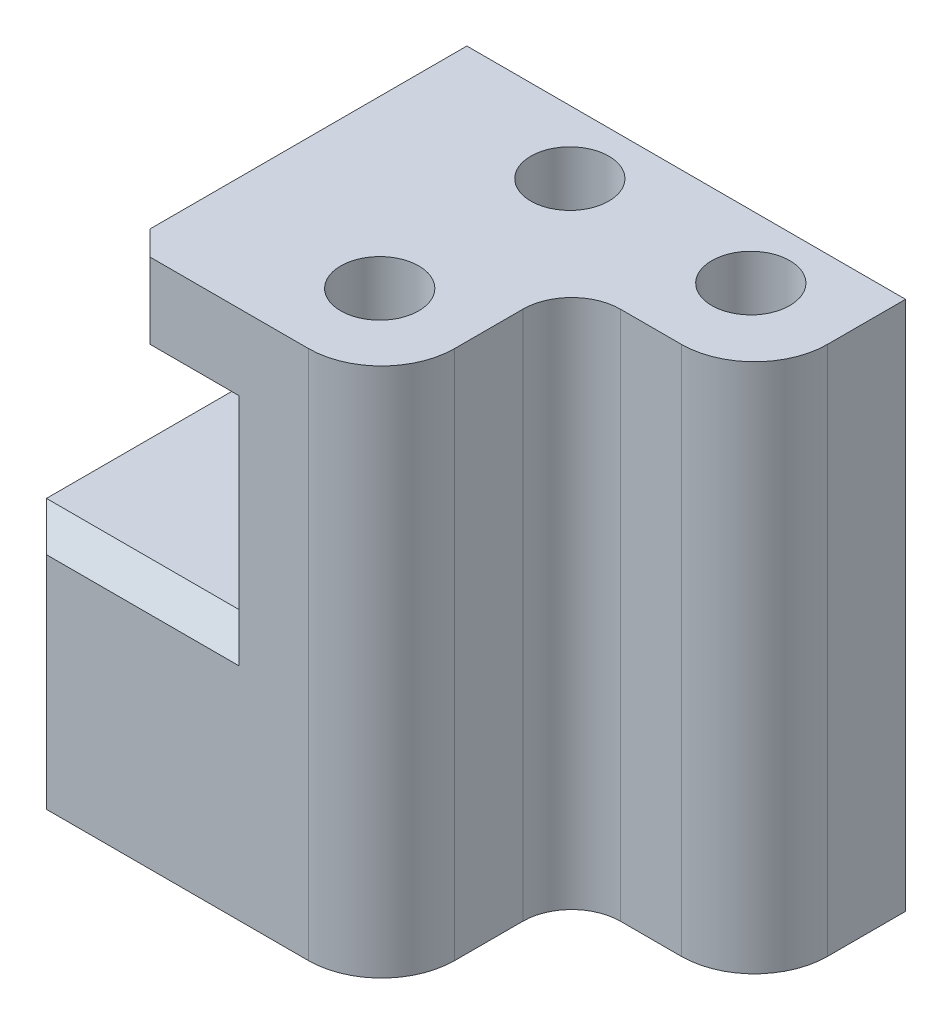
ISO-10303-21;
HEADER;
FILE_DESCRIPTION(('STEP AP214'),'2;1');
FILE_NAME('part.step','',(''),(''),'','','');
FILE_SCHEMA(('AUTOMOTIVE_DESIGN { 1 0 10303 214 1 1 1 1 }'));
ENDSEC;
DATA;
#1=APPLICATION_CONTEXT('core data for automotive mechanical design processes');
#2=APPLICATION_PROTOCOL_DEFINITION('international standard','automotive_design',2000,#1);
#3=PRODUCT_CONTEXT('',#1,'mechanical');
#4=PRODUCT('Part','Part','',(#3));
#5=PRODUCT_RELATED_PRODUCT_CATEGORY('part','',(#4));
#6=PRODUCT_DEFINITION_FORMATION('','',#4);
#7=PRODUCT_DEFINITION_CONTEXT('part definition',#1,'design');
#8=PRODUCT_DEFINITION('design','',#6,#7);
#9=PRODUCT_DEFINITION_SHAPE('','',#8);
#10=(LENGTH_UNIT() NAMED_UNIT(*) SI_UNIT(.MILLI.,.METRE.));
#11=(NAMED_UNIT(*) PLANE_ANGLE_UNIT() SI_UNIT($,.RADIAN.));
#12=(NAMED_UNIT(*) SI_UNIT($,.STERADIAN.) SOLID_ANGLE_UNIT());
#13=UNCERTAINTY_MEASURE_WITH_UNIT(LENGTH_MEASURE(1.E-05),#10,'distance_accuracy_value','');
#14=(GEOMETRIC_REPRESENTATION_CONTEXT(3) GLOBAL_UNCERTAINTY_ASSIGNED_CONTEXT((#13)) GLOBAL_UNIT_ASSIGNED_CONTEXT((#10,
#11,#12)) REPRESENTATION_CONTEXT('',''));
#15=CARTESIAN_POINT('',(0.,0.,0.));
#16=DIRECTION('',(0.,0.,1.));
#17=DIRECTION('',(1.,0.,0.));
#18=AXIS2_PLACEMENT_3D('',#15,#16,#17);
#19=CARTESIAN_POINT('',(-14.75,0.,15.));
#20=DIRECTION('',(0.,1.,0.));
#21=DIRECTION('',(0.,0.,1.));
#22=AXIS2_PLACEMENT_3D('',#19,#20,#21);
#23=PLANE('',#22);
#24=CARTESIAN_POINT('',(-3.67499999999998,0.,3.6));
#25=DIRECTION('',(0.,1.,0.));
#26=DIRECTION('',(0.,0.,1.));
#27=AXIS2_PLACEMENT_3D('',#24,#25,#26);
#28=CIRCLE('',#27,1.6);
#29=CARTESIAN_POINT('',(-3.67499999999998,0.,5.2));
#30=VERTEX_POINT('',#29);
#31=EDGE_CURVE('E356',#30,#30,#28,.F.);
#32=ORIENTED_EDGE('',*,*,#31,.F.);
#33=EDGE_LOOP('',(#32));
#34=FACE_BOUND('',#33,.T.);
#35=CARTESIAN_POINT('',(-3.67499999999998,0.,11.4));
#36=DIRECTION('',(0.,1.,0.));
#37=DIRECTION('',(0.,0.,1.));
#38=AXIS2_PLACEMENT_3D('',#35,#36,#37);
#39=CIRCLE('',#38,1.6);
#40=CARTESIAN_POINT('',(-3.67499999999998,0.,13.));
#41=VERTEX_POINT('',#40);
#42=EDGE_CURVE('E357',#41,#41,#39,.F.);
#43=ORIENTED_EDGE('',*,*,#42,.F.);
#44=EDGE_LOOP('',(#43));
#45=FACE_BOUND('',#44,.T.);
#46=DIRECTION('',(1.,0.,0.));
#47=VECTOR('',#46,1.);
#48=CARTESIAN_POINT('',(-14.75,0.,15.));
#49=LINE('',#48,#47);
#50=CARTESIAN_POINT('',(-13.75,0.,15.));
#51=VERTEX_POINT('',#50);
#52=CARTESIAN_POINT('',(-3.,0.,15.));
#53=VERTEX_POINT('',#52);
#54=EDGE_CURVE('E354',#51,#53,#49,.T.);
#55=ORIENTED_EDGE('',*,*,#54,.F.);
#56=DIRECTION('',(-0.707106781186546,0.,-0.707106781186549));
#57=VECTOR('',#56,1.);
#58=CARTESIAN_POINT('',(-13.75,0.,15.));
#59=LINE('',#58,#57);
#60=CARTESIAN_POINT('',(-14.75,0.,14.));
#61=VERTEX_POINT('',#60);
#62=EDGE_CURVE('E297',#51,#61,#59,.T.);
#63=ORIENTED_EDGE('',*,*,#62,.T.);
#64=DIRECTION('',(0.,0.,-1.));
#65=VECTOR('',#64,1.);
#66=CARTESIAN_POINT('',(-14.75,0.,15.));
#67=LINE('',#66,#65);
#68=CARTESIAN_POINT('',(-14.75,0.,0.999999999999997));
#69=VERTEX_POINT('',#68);
#70=EDGE_CURVE('E350',#61,#69,#67,.T.);
#71=ORIENTED_EDGE('',*,*,#70,.T.);
#72=DIRECTION('',(1.,0.,0.));
#73=VECTOR('',#72,1.);
#74=CARTESIAN_POINT('',(-14.75,0.,0.999999999999997));
#75=LINE('',#74,#73);
#76=CARTESIAN_POINT('',(7.50000000000001,0.,0.999999999999997));
#77=VERTEX_POINT('',#76);
#78=EDGE_CURVE('E261',#69,#77,#75,.T.);
#79=ORIENTED_EDGE('',*,*,#78,.T.);
#80=DIRECTION('',(0.,0.,1.));
#81=VECTOR('',#80,1.);
#82=CARTESIAN_POINT('',(7.50000000000001,0.,7.2));
#83=LINE('',#82,#81);
#84=CARTESIAN_POINT('',(7.50000000000001,0.,4.2));
#85=VERTEX_POINT('',#84);
#86=EDGE_CURVE('E373',#77,#85,#83,.T.);
#87=ORIENTED_EDGE('',*,*,#86,.T.);
#88=CARTESIAN_POINT('',(4.50000000000001,0.,4.2));
#89=DIRECTION('',(0.,1.,0.));
#90=DIRECTION('',(0.,0.,1.));
#91=AXIS2_PLACEMENT_3D('',#88,#89,#90);
#92=CIRCLE('',#91,3.);
#93=CARTESIAN_POINT('',(4.50000000000002,0.,7.2));
#94=VERTEX_POINT('',#93);
#95=EDGE_CURVE('E213',#85,#94,#92,.F.);
#96=ORIENTED_EDGE('',*,*,#95,.T.);
#97=DIRECTION('',(-1.,0.,0.));
#98=VECTOR('',#97,1.);
#99=CARTESIAN_POINT('',(7.50000000000002,0.,7.2));
#100=LINE('',#99,#98);
#101=CARTESIAN_POINT('',(2.,0.,7.2));
#102=VERTEX_POINT('',#101);
#103=EDGE_CURVE('E191',#94,#102,#100,.T.);
#104=ORIENTED_EDGE('',*,*,#103,.T.);
#105=CARTESIAN_POINT('',(2.,0.,9.2));
#106=DIRECTION('',(0.,1.,0.));
#107=DIRECTION('',(0.,0.,1.));
#108=AXIS2_PLACEMENT_3D('',#105,#106,#107);
#109=CIRCLE('',#108,2.);
#110=CARTESIAN_POINT('',(0.,0.,9.2));
#111=VERTEX_POINT('',#110);
#112=EDGE_CURVE('E187',#102,#111,#109,.T.);
#113=ORIENTED_EDGE('',*,*,#112,.T.);
#114=DIRECTION('',(0.,0.,-1.));
#115=VECTOR('',#114,1.);
#116=CARTESIAN_POINT('',(0.,0.,15.));
#117=LINE('',#116,#115);
#118=CARTESIAN_POINT('',(0.,0.,12.));
#119=VERTEX_POINT('',#118);
#120=EDGE_CURVE('E173',#119,#111,#117,.T.);
#121=ORIENTED_EDGE('',*,*,#120,.F.);
#122=CARTESIAN_POINT('',(-3.,0.,12.));
#123=DIRECTION('',(0.,1.,0.));
#124=DIRECTION('',(0.,0.,1.));
#125=AXIS2_PLACEMENT_3D('',#122,#123,#124);
#126=CIRCLE('',#125,3.);
#127=EDGE_CURVE('E215',#119,#53,#126,.F.);
#128=ORIENTED_EDGE('',*,*,#127,.T.);
#129=EDGE_LOOP('',(#55,#63,#71,#79,#87,#96,#104,#113,#121,#128));
#130=FACE_BOUND('',#129,.T.);
#131=CARTESIAN_POINT('',(3.75000000000001,0.,3.6));
#132=DIRECTION('',(0.,1.,0.));
#133=DIRECTION('',(0.,0.,1.));
#134=AXIS2_PLACEMENT_3D('',#131,#132,#133);
#135=CIRCLE('',#134,1.6);
#136=CARTESIAN_POINT('',(3.75000000000001,0.,5.2));
#137=VERTEX_POINT('',#136);
#138=EDGE_CURVE('E364',#137,#137,#135,.F.);
#139=ORIENTED_EDGE('',*,*,#138,.F.);
#140=EDGE_LOOP('',(#139));
#141=FACE_BOUND('',#140,.T.);
#142=ADVANCED_FACE('F35',(#34,#45,#130,#141),#23,.F.);
#143=CARTESIAN_POINT('',(0.,0.,15.));
#144=DIRECTION('',(-1.,0.,0.));
#145=DIRECTION('',(0.,0.,1.));
#146=AXIS2_PLACEMENT_3D('',#143,#144,#145);
#147=PLANE('',#146);
#148=DIRECTION('',(0.,0.,-1.));
#149=VECTOR('',#148,1.);
#150=CARTESIAN_POINT('',(0.,21.75,15.));
#151=LINE('',#150,#149);
#152=CARTESIAN_POINT('',(0.,21.75,12.));
#153=VERTEX_POINT('',#152);
#154=CARTESIAN_POINT('',(0.,21.75,9.2));
#155=VERTEX_POINT('',#154);
#156=EDGE_CURVE('E184',#153,#155,#151,.T.);
#157=ORIENTED_EDGE('',*,*,#156,.F.);
#158=DIRECTION('',(0.,1.,0.));
#159=VECTOR('',#158,1.);
#160=CARTESIAN_POINT('',(0.,0.,12.));
#161=LINE('',#160,#159);
#162=EDGE_CURVE('E180',#153,#119,#161,.F.);
#163=ORIENTED_EDGE('',*,*,#162,.T.);
#164=ORIENTED_EDGE('',*,*,#120,.T.);
#165=DIRECTION('',(0.,1.,0.));
#166=VECTOR('',#165,1.);
#167=CARTESIAN_POINT('',(0.,0.,9.2));
#168=LINE('',#167,#166);
#169=EDGE_CURVE('E178',#111,#155,#168,.T.);
#170=ORIENTED_EDGE('',*,*,#169,.T.);
#171=EDGE_LOOP('',(#157,#163,#164,#170));
#172=FACE_BOUND('',#171,.T.);
#173=ADVANCED_FACE('F176',(#172),#147,.F.);
#174=CARTESIAN_POINT('',(0.,21.75,15.));
#175=DIRECTION('',(0.,-1.,0.));
#176=DIRECTION('',(1.,0.,0.));
#177=AXIS2_PLACEMENT_3D('',#174,#175,#176);
#178=PLANE('',#177);
#179=CARTESIAN_POINT('',(-3.67499999999999,21.75,3.6));
#180=DIRECTION('',(0.,1.,0.));
#181=DIRECTION('',(-1.,0.,0.));
#182=AXIS2_PLACEMENT_3D('',#179,#180,#181);
#183=CIRCLE('',#182,1.6);
#184=CARTESIAN_POINT('',(-5.27499999999999,21.75,3.6));
#185=VERTEX_POINT('',#184);
#186=EDGE_CURVE('E360',#185,#185,#183,.T.);
#187=ORIENTED_EDGE('',*,*,#186,.F.);
#188=EDGE_LOOP('',(#187));
#189=FACE_BOUND('',#188,.T.);
#190=CARTESIAN_POINT('',(-3.67499999999999,21.75,11.4));
#191=DIRECTION('',(0.,1.,0.));
#192=DIRECTION('',(-1.,0.,0.));
#193=AXIS2_PLACEMENT_3D('',#190,#191,#192);
#194=CIRCLE('',#193,1.6);
#195=CARTESIAN_POINT('',(-5.27499999999999,21.75,11.4));
#196=VERTEX_POINT('',#195);
#197=EDGE_CURVE('E361',#196,#196,#194,.T.);
#198=ORIENTED_EDGE('',*,*,#197,.F.);
#199=EDGE_LOOP('',(#198));
#200=FACE_BOUND('',#199,.T.);
#201=DIRECTION('',(0.,0.,-1.));
#202=VECTOR('',#201,1.);
#203=CARTESIAN_POINT('',(-10.5,21.75,15.));
#204=LINE('',#203,#202);
#205=CARTESIAN_POINT('',(-10.5,21.75,14.));
#206=VERTEX_POINT('',#205);
#207=CARTESIAN_POINT('',(-10.5,21.75,0.999999999999997));
#208=VERTEX_POINT('',#207);
#209=EDGE_CURVE('E331',#206,#208,#204,.T.);
#210=ORIENTED_EDGE('',*,*,#209,.F.);
#211=DIRECTION('',(0.707106781186545,0.,0.707106781186549));
#212=VECTOR('',#211,1.);
#213=CARTESIAN_POINT('',(-9.49999999999999,21.75,15.));
#214=LINE('',#213,#212);
#215=CARTESIAN_POINT('',(-9.5,21.75,15.));
#216=VERTEX_POINT('',#215);
#217=EDGE_CURVE('E303',#206,#216,#214,.T.);
#218=ORIENTED_EDGE('',*,*,#217,.T.);
#219=DIRECTION('',(-1.,0.,0.));
#220=VECTOR('',#219,1.);
#221=CARTESIAN_POINT('',(0.,21.75,15.));
#222=LINE('',#221,#220);
#223=CARTESIAN_POINT('',(-3.,21.75,15.));
#224=VERTEX_POINT('',#223);
#225=EDGE_CURVE('E352',#224,#216,#222,.T.);
#226=ORIENTED_EDGE('',*,*,#225,.F.);
#227=CARTESIAN_POINT('',(-3.,21.75,12.));
#228=DIRECTION('',(0.,-1.,0.));
#229=DIRECTION('',(1.,0.,0.));
#230=AXIS2_PLACEMENT_3D('',#227,#228,#229);
#231=CIRCLE('',#230,3.);
#232=EDGE_CURVE('E210',#224,#153,#231,.F.);
#233=ORIENTED_EDGE('',*,*,#232,.T.);
#234=ORIENTED_EDGE('',*,*,#156,.T.);
#235=CARTESIAN_POINT('',(2.,21.75,9.2));
#236=DIRECTION('',(0.,-1.,0.));
#237=DIRECTION('',(1.,0.,0.));
#238=AXIS2_PLACEMENT_3D('',#235,#236,#237);
#239=CIRCLE('',#238,2.);
#240=CARTESIAN_POINT('',(2.,21.75,7.2));
#241=VERTEX_POINT('',#240);
#242=EDGE_CURVE('E196',#155,#241,#239,.T.);
#243=ORIENTED_EDGE('',*,*,#242,.T.);
#244=DIRECTION('',(1.,0.,0.));
#245=VECTOR('',#244,1.);
#246=CARTESIAN_POINT('',(7.50000000000001,21.75,7.2));
#247=LINE('',#246,#245);
#248=CARTESIAN_POINT('',(4.50000000000001,21.75,7.2));
#249=VERTEX_POINT('',#248);
#250=EDGE_CURVE('E374',#241,#249,#247,.T.);
#251=ORIENTED_EDGE('',*,*,#250,.T.);
#252=CARTESIAN_POINT('',(4.50000000000001,21.75,4.2));
#253=DIRECTION('',(0.,-1.,0.));
#254=DIRECTION('',(1.,0.,0.));
#255=AXIS2_PLACEMENT_3D('',#252,#253,#254);
#256=CIRCLE('',#255,3.);
#257=CARTESIAN_POINT('',(7.50000000000001,21.75,4.2));
#258=VERTEX_POINT('',#257);
#259=EDGE_CURVE('E208',#249,#258,#256,.F.);
#260=ORIENTED_EDGE('',*,*,#259,.T.);
#261=DIRECTION('',(0.,0.,-1.));
#262=VECTOR('',#261,1.);
#263=CARTESIAN_POINT('',(7.50000000000001,21.75,7.2));
#264=LINE('',#263,#262);
#265=CARTESIAN_POINT('',(7.50000000000001,21.75,0.999999999999999));
#266=VERTEX_POINT('',#265);
#267=EDGE_CURVE('E371',#258,#266,#264,.T.);
#268=ORIENTED_EDGE('',*,*,#267,.T.);
#269=DIRECTION('',(-1.,0.,0.));
#270=VECTOR('',#269,1.);
#271=CARTESIAN_POINT('',(0.,21.75,0.999999999999997));
#272=LINE('',#271,#270);
#273=EDGE_CURVE('E243',#266,#208,#272,.T.);
#274=ORIENTED_EDGE('',*,*,#273,.T.);
#275=EDGE_LOOP('',(#210,#218,#226,#233,#234,#243,#251,#260,#268,#274));
#276=FACE_BOUND('',#275,.T.);
#277=CARTESIAN_POINT('',(3.75000000000001,21.75,3.6));
#278=DIRECTION('',(0.,1.,0.));
#279=DIRECTION('',(-1.,0.,0.));
#280=AXIS2_PLACEMENT_3D('',#277,#278,#279);
#281=CIRCLE('',#280,1.6);
#282=CARTESIAN_POINT('',(2.15000000000001,21.75,3.6));
#283=VERTEX_POINT('',#282);
#284=EDGE_CURVE('E286',#283,#283,#281,.T.);
#285=ORIENTED_EDGE('',*,*,#284,.F.);
#286=EDGE_LOOP('',(#285));
#287=FACE_BOUND('',#286,.T.);
#288=ADVANCED_FACE('F334',(#189,#200,#276,#287),#178,.F.);
#289=CARTESIAN_POINT('',(-10.5,21.75,15.));
#290=DIRECTION('',(1.,0.,0.));
#291=DIRECTION('',(0.,1.,0.));
#292=AXIS2_PLACEMENT_3D('',#289,#290,#291);
#293=PLANE('',#292);
#294=DIRECTION('',(0.,0.,-1.));
#295=VECTOR('',#294,1.);
#296=CARTESIAN_POINT('',(-10.5,17.65,15.));
#297=LINE('',#296,#295);
#298=CARTESIAN_POINT('',(-10.5,17.65,14.));
#299=VERTEX_POINT('',#298);
#300=CARTESIAN_POINT('',(-10.5,17.65,0.999999999999997));
#301=VERTEX_POINT('',#300);
#302=EDGE_CURVE('E332',#299,#301,#297,.T.);
#303=ORIENTED_EDGE('',*,*,#302,.F.);
#304=DIRECTION('',(0.,1.,0.));
#305=VECTOR('',#304,1.);
#306=CARTESIAN_POINT('',(-10.5,21.75,14.));
#307=LINE('',#306,#305);
#308=EDGE_CURVE('E301',#299,#206,#307,.T.);
#309=ORIENTED_EDGE('',*,*,#308,.T.);
#310=ORIENTED_EDGE('',*,*,#209,.T.);
#311=DIRECTION('',(0.,-1.,0.));
#312=VECTOR('',#311,1.);
#313=CARTESIAN_POINT('',(-10.5,21.75,0.999999999999997));
#314=LINE('',#313,#312);
#315=EDGE_CURVE('E246',#208,#301,#314,.T.);
#316=ORIENTED_EDGE('',*,*,#315,.T.);
#317=EDGE_LOOP('',(#303,#309,#310,#316));
#318=FACE_BOUND('',#317,.T.);
#319=ADVANCED_FACE('F330',(#318),#293,.F.);
#320=CARTESIAN_POINT('',(-10.5,17.65,15.));
#321=DIRECTION('',(0.,1.,0.));
#322=DIRECTION('',(0.,0.,1.));
#323=AXIS2_PLACEMENT_3D('',#320,#321,#322);
#324=PLANE('',#323);
#325=DIRECTION('',(0.,0.,-1.));
#326=VECTOR('',#325,1.);
#327=CARTESIAN_POINT('',(-6.85,17.65,15.));
#328=LINE('',#327,#326);
#329=CARTESIAN_POINT('',(-6.85,17.65,14.));
#330=VERTEX_POINT('',#329);
#331=CARTESIAN_POINT('',(-6.85,17.65,0.999999999999997));
#332=VERTEX_POINT('',#331);
#333=EDGE_CURVE('E342',#330,#332,#328,.T.);
#334=ORIENTED_EDGE('',*,*,#333,.F.);
#335=DIRECTION('',(-1.,0.,0.));
#336=VECTOR('',#335,1.);
#337=CARTESIAN_POINT('',(-10.5,17.65,14.));
#338=LINE('',#337,#336);
#339=EDGE_CURVE('E11',#330,#299,#338,.T.);
#340=ORIENTED_EDGE('',*,*,#339,.T.);
#341=ORIENTED_EDGE('',*,*,#302,.T.);
#342=DIRECTION('',(1.,0.,0.));
#343=VECTOR('',#342,1.);
#344=CARTESIAN_POINT('',(-10.5,17.65,0.999999999999997));
#345=LINE('',#344,#343);
#346=EDGE_CURVE('E249',#301,#332,#345,.T.);
#347=ORIENTED_EDGE('',*,*,#346,.T.);
#348=EDGE_LOOP('',(#334,#340,#341,#347));
#349=FACE_BOUND('',#348,.T.);
#350=ADVANCED_FACE('F534',(#349),#324,.F.);
#351=CARTESIAN_POINT('',(-6.85,17.65,15.));
#352=DIRECTION('',(1.,0.,0.));
#353=DIRECTION('',(0.,1.,0.));
#354=AXIS2_PLACEMENT_3D('',#351,#352,#353);
#355=PLANE('',#354);
#356=DIRECTION('',(0.,0.,-1.));
#357=VECTOR('',#356,1.);
#358=CARTESIAN_POINT('',(-6.85,10.05,15.));
#359=LINE('',#358,#357);
#360=CARTESIAN_POINT('',(-6.85,10.05,14.));
#361=VERTEX_POINT('',#360);
#362=CARTESIAN_POINT('',(-6.85,10.05,0.999999999999997));
#363=VERTEX_POINT('',#362);
#364=EDGE_CURVE('E346',#361,#363,#359,.T.);
#365=ORIENTED_EDGE('',*,*,#364,.F.);
#366=DIRECTION('',(0.,1.,0.));
#367=VECTOR('',#366,1.);
#368=CARTESIAN_POINT('',(-6.85,17.65,14.));
#369=LINE('',#368,#367);
#370=EDGE_CURVE('E44',#361,#330,#369,.T.);
#371=ORIENTED_EDGE('',*,*,#370,.T.);
#372=ORIENTED_EDGE('',*,*,#333,.T.);
#373=DIRECTION('',(0.,-1.,0.));
#374=VECTOR('',#373,1.);
#375=CARTESIAN_POINT('',(-6.85,17.65,0.999999999999997));
#376=LINE('',#375,#374);
#377=EDGE_CURVE('E252',#332,#363,#376,.T.);
#378=ORIENTED_EDGE('',*,*,#377,.T.);
#379=EDGE_LOOP('',(#365,#371,#372,#378));
#380=FACE_BOUND('',#379,.T.);
#381=ADVANCED_FACE('F525',(#380),#355,.F.);
#382=CARTESIAN_POINT('',(-6.85,10.05,15.));
#383=DIRECTION('',(0.,-1.,0.));
#384=DIRECTION('',(1.,0.,0.));
#385=AXIS2_PLACEMENT_3D('',#382,#383,#384);
#386=PLANE('',#385);
#387=DIRECTION('',(0.,0.,-1.));
#388=VECTOR('',#387,1.);
#389=CARTESIAN_POINT('',(-14.75,10.05,15.));
#390=LINE('',#389,#388);
#391=CARTESIAN_POINT('',(-14.75,10.05,14.));
#392=VERTEX_POINT('',#391);
#393=CARTESIAN_POINT('',(-14.75,10.05,0.999999999999997));
#394=VERTEX_POINT('',#393);
#395=EDGE_CURVE('E348',#392,#394,#390,.T.);
#396=ORIENTED_EDGE('',*,*,#395,.F.);
#397=DIRECTION('',(1.,0.,0.));
#398=VECTOR('',#397,1.);
#399=CARTESIAN_POINT('',(-6.85,10.05,14.));
#400=LINE('',#399,#398);
#401=EDGE_CURVE('E59',#392,#361,#400,.T.);
#402=ORIENTED_EDGE('',*,*,#401,.T.);
#403=ORIENTED_EDGE('',*,*,#364,.T.);
#404=DIRECTION('',(-1.,0.,0.));
#405=VECTOR('',#404,1.);
#406=CARTESIAN_POINT('',(-6.85,10.05,0.999999999999997));
#407=LINE('',#406,#405);
#408=EDGE_CURVE('E255',#363,#394,#407,.T.);
#409=ORIENTED_EDGE('',*,*,#408,.T.);
#410=EDGE_LOOP('',(#396,#402,#403,#409));
#411=FACE_BOUND('',#410,.T.);
#412=ADVANCED_FACE('F408',(#411),#386,.F.);
#413=CARTESIAN_POINT('',(-14.75,10.05,15.));
#414=DIRECTION('',(1.,0.,0.));
#415=DIRECTION('',(0.,1.,0.));
#416=AXIS2_PLACEMENT_3D('',#413,#414,#415);
#417=PLANE('',#416);
#418=ORIENTED_EDGE('',*,*,#70,.F.);
#419=DIRECTION('',(0.,1.,0.));
#420=VECTOR('',#419,1.);
#421=CARTESIAN_POINT('',(-14.75,10.05,14.));
#422=LINE('',#421,#420);
#423=EDGE_CURVE('E299',#61,#392,#422,.T.);
#424=ORIENTED_EDGE('',*,*,#423,.T.);
#425=ORIENTED_EDGE('',*,*,#395,.T.);
#426=DIRECTION('',(0.,-1.,0.));
#427=VECTOR('',#426,1.);
#428=CARTESIAN_POINT('',(-14.75,10.05,0.999999999999997));
#429=LINE('',#428,#427);
#430=EDGE_CURVE('E258',#394,#69,#429,.T.);
#431=ORIENTED_EDGE('',*,*,#430,.T.);
#432=EDGE_LOOP('',(#418,#424,#425,#431));
#433=FACE_BOUND('',#432,.T.);
#434=ADVANCED_FACE('F407',(#433),#417,.F.);
#435=CARTESIAN_POINT('',(0.,0.,15.));
#436=DIRECTION('',(0.,0.,1.));
#437=DIRECTION('',(1.,0.,0.));
#438=AXIS2_PLACEMENT_3D('',#435,#436,#437);
#439=PLANE('',#438);
#440=DIRECTION('',(-1.,0.,0.));
#441=VECTOR('',#440,1.);
#442=CARTESIAN_POINT('',(-14.75,9.05,15.));
#443=LINE('',#442,#441);
#444=CARTESIAN_POINT('',(-5.85,9.05,15.));
#445=VERTEX_POINT('',#444);
#446=CARTESIAN_POINT('',(-13.75,9.05,15.));
#447=VERTEX_POINT('',#446);
#448=EDGE_CURVE('E290',#445,#447,#443,.T.);
#449=ORIENTED_EDGE('',*,*,#448,.T.);
#450=DIRECTION('',(0.,-1.,0.));
#451=VECTOR('',#450,1.);
#452=CARTESIAN_POINT('',(-13.75,0.,15.));
#453=LINE('',#452,#451);
#454=EDGE_CURVE('E294',#447,#51,#453,.T.);
#455=ORIENTED_EDGE('',*,*,#454,.T.);
#456=ORIENTED_EDGE('',*,*,#54,.T.);
#457=DIRECTION('',(0.,1.,0.));
#458=VECTOR('',#457,1.);
#459=CARTESIAN_POINT('',(-3.,21.75,15.));
#460=LINE('',#459,#458);
#461=EDGE_CURVE('E195',#53,#224,#460,.T.);
#462=ORIENTED_EDGE('',*,*,#461,.T.);
#463=ORIENTED_EDGE('',*,*,#225,.T.);
#464=DIRECTION('',(0.,-1.,0.));
#465=VECTOR('',#464,1.);
#466=CARTESIAN_POINT('',(-9.5,17.65,15.));
#467=LINE('',#466,#465);
#468=CARTESIAN_POINT('',(-9.5,18.65,15.));
#469=VERTEX_POINT('',#468);
#470=EDGE_CURVE('E292',#216,#469,#467,.T.);
#471=ORIENTED_EDGE('',*,*,#470,.T.);
#472=DIRECTION('',(1.,0.,0.));
#473=VECTOR('',#472,1.);
#474=CARTESIAN_POINT('',(-6.85,18.65,15.));
#475=LINE('',#474,#473);
#476=CARTESIAN_POINT('',(-5.85,18.65,15.));
#477=VERTEX_POINT('',#476);
#478=EDGE_CURVE('E263',#469,#477,#475,.T.);
#479=ORIENTED_EDGE('',*,*,#478,.T.);
#480=DIRECTION('',(0.,-1.,0.));
#481=VECTOR('',#480,1.);
#482=CARTESIAN_POINT('',(-5.85,10.05,15.));
#483=LINE('',#482,#481);
#484=EDGE_CURVE('E288',#477,#445,#483,.T.);
#485=ORIENTED_EDGE('',*,*,#484,.T.);
#486=EDGE_LOOP('',(#449,#455,#456,#462,#463,#471,#479,#485));
#487=FACE_BOUND('',#486,.T.);
#488=ADVANCED_FACE('F399',(#487),#439,.T.);
#489=CARTESIAN_POINT('',(0.,0.,0.));
#490=DIRECTION('',(0.,0.,1.));
#491=DIRECTION('',(1.,0.,0.));
#492=AXIS2_PLACEMENT_3D('',#489,#490,#491);
#493=PLANE('',#492);
#494=DIRECTION('',(1.,0.,0.));
#495=VECTOR('',#494,1.);
#496=CARTESIAN_POINT('',(0.,20.75,0.));
#497=LINE('',#496,#495);
#498=CARTESIAN_POINT('',(-9.49999999999999,20.75,0.));
#499=VERTEX_POINT('',#498);
#500=CARTESIAN_POINT('',(6.50000000000001,20.75,0.));
#501=VERTEX_POINT('',#500);
#502=EDGE_CURVE('E238',#499,#501,#497,.T.);
#503=ORIENTED_EDGE('',*,*,#502,.T.);
#504=DIRECTION('',(0.,-1.,0.));
#505=VECTOR('',#504,1.);
#506=CARTESIAN_POINT('',(6.50000000000001,0.,0.));
#507=LINE('',#506,#505);
#508=CARTESIAN_POINT('',(6.50000000000001,1.,0.));
#509=VERTEX_POINT('',#508);
#510=EDGE_CURVE('E240',#501,#509,#507,.T.);
#511=ORIENTED_EDGE('',*,*,#510,.T.);
#512=DIRECTION('',(-1.,0.,0.));
#513=VECTOR('',#512,1.);
#514=CARTESIAN_POINT('',(0.,1.,0.));
#515=LINE('',#514,#513);
#516=CARTESIAN_POINT('',(-13.75,1.,0.));
#517=VERTEX_POINT('',#516);
#518=EDGE_CURVE('E226',#509,#517,#515,.T.);
#519=ORIENTED_EDGE('',*,*,#518,.T.);
#520=DIRECTION('',(0.,1.,0.));
#521=VECTOR('',#520,1.);
#522=CARTESIAN_POINT('',(-13.75,0.,0.));
#523=LINE('',#522,#521);
#524=CARTESIAN_POINT('',(-13.75,9.04999999999999,0.));
#525=VERTEX_POINT('',#524);
#526=EDGE_CURVE('E228',#517,#525,#523,.T.);
#527=ORIENTED_EDGE('',*,*,#526,.T.);
#528=DIRECTION('',(1.,0.,0.));
#529=VECTOR('',#528,1.);
#530=CARTESIAN_POINT('',(0.,9.05,0.));
#531=LINE('',#530,#529);
#532=CARTESIAN_POINT('',(-5.84999999999999,9.05,0.));
#533=VERTEX_POINT('',#532);
#534=EDGE_CURVE('E230',#525,#533,#531,.T.);
#535=ORIENTED_EDGE('',*,*,#534,.T.);
#536=DIRECTION('',(0.,1.,0.));
#537=VECTOR('',#536,1.);
#538=CARTESIAN_POINT('',(-5.84999999999999,0.,0.));
#539=LINE('',#538,#537);
#540=CARTESIAN_POINT('',(-5.84999999999999,18.65,0.));
#541=VERTEX_POINT('',#540);
#542=EDGE_CURVE('E232',#533,#541,#539,.T.);
#543=ORIENTED_EDGE('',*,*,#542,.T.);
#544=DIRECTION('',(-1.,0.,0.));
#545=VECTOR('',#544,1.);
#546=CARTESIAN_POINT('',(0.,18.65,0.));
#547=LINE('',#546,#545);
#548=CARTESIAN_POINT('',(-9.49999999999999,18.65,0.));
#549=VERTEX_POINT('',#548);
#550=EDGE_CURVE('E234',#541,#549,#547,.T.);
#551=ORIENTED_EDGE('',*,*,#550,.T.);
#552=DIRECTION('',(0.,1.,0.));
#553=VECTOR('',#552,1.);
#554=CARTESIAN_POINT('',(-9.49999999999999,0.,0.));
#555=LINE('',#554,#553);
#556=EDGE_CURVE('E236',#549,#499,#555,.T.);
#557=ORIENTED_EDGE('',*,*,#556,.T.);
#558=EDGE_LOOP('',(#503,#511,#519,#527,#535,#543,#551,#557));
#559=FACE_BOUND('',#558,.T.);
#560=ADVANCED_FACE('F506',(#559),#493,.F.);
#561=CARTESIAN_POINT('',(-3.67499999999998,-0.001000000000001,11.4));
#562=DIRECTION('',(0.,1.,0.));
#563=DIRECTION('',(-1.,0.,0.));
#564=AXIS2_PLACEMENT_3D('',#561,#562,#563);
#565=CYLINDRICAL_SURFACE('',#564,1.6);
#566=ORIENTED_EDGE('',*,*,#197,.T.);
#567=EDGE_LOOP('',(#566));
#568=FACE_BOUND('',#567,.T.);
#569=ORIENTED_EDGE('',*,*,#42,.T.);
#570=EDGE_LOOP('',(#569));
#571=FACE_BOUND('',#570,.T.);
#572=ADVANCED_FACE('F634',(#568,#571),#565,.F.);
#573=CARTESIAN_POINT('',(-3.67499999999998,-0.001000000000001,3.6));
#574=DIRECTION('',(0.,1.,0.));
#575=DIRECTION('',(-1.,0.,0.));
#576=AXIS2_PLACEMENT_3D('',#573,#574,#575);
#577=CYLINDRICAL_SURFACE('',#576,1.6);
#578=ORIENTED_EDGE('',*,*,#186,.T.);
#579=EDGE_LOOP('',(#578));
#580=FACE_BOUND('',#579,.T.);
#581=ORIENTED_EDGE('',*,*,#31,.T.);
#582=EDGE_LOOP('',(#581));
#583=FACE_BOUND('',#582,.T.);
#584=ADVANCED_FACE('F655',(#580,#583),#577,.F.);
#585=CARTESIAN_POINT('',(7.50000000000002,-10.3966340706981,7.2));
#586=DIRECTION('',(0.,0.,1.));
#587=DIRECTION('',(1.,0.,0.));
#588=AXIS2_PLACEMENT_3D('',#585,#586,#587);
#589=PLANE('',#588);
#590=ORIENTED_EDGE('',*,*,#103,.F.);
#591=DIRECTION('',(0.,1.,0.));
#592=VECTOR('',#591,1.);
#593=CARTESIAN_POINT('',(4.50000000000002,-10.3966340706981,7.2));
#594=LINE('',#593,#592);
#595=EDGE_CURVE('E217',#94,#249,#594,.T.);
#596=ORIENTED_EDGE('',*,*,#595,.T.);
#597=ORIENTED_EDGE('',*,*,#250,.F.);
#598=DIRECTION('',(0.,1.,0.));
#599=VECTOR('',#598,1.);
#600=CARTESIAN_POINT('',(2.,-10.3966340706981,7.2));
#601=LINE('',#600,#599);
#602=EDGE_CURVE('E200',#241,#102,#601,.F.);
#603=ORIENTED_EDGE('',*,*,#602,.T.);
#604=EDGE_LOOP('',(#590,#596,#597,#603));
#605=FACE_BOUND('',#604,.T.);
#606=ADVANCED_FACE('F393',(#605),#589,.T.);
#607=CARTESIAN_POINT('',(7.50000000000002,-10.3966340706981,7.2));
#608=DIRECTION('',(1.,0.,0.));
#609=DIRECTION('',(0.,1.,0.));
#610=AXIS2_PLACEMENT_3D('',#607,#608,#609);
#611=PLANE('',#610);
#612=ORIENTED_EDGE('',*,*,#86,.F.);
#613=DIRECTION('',(0.,1.,0.));
#614=VECTOR('',#613,1.);
#615=CARTESIAN_POINT('',(7.50000000000001,21.75,0.999999999999997));
#616=LINE('',#615,#614);
#617=EDGE_CURVE('E223',#77,#266,#616,.T.);
#618=ORIENTED_EDGE('',*,*,#617,.T.);
#619=ORIENTED_EDGE('',*,*,#267,.F.);
#620=DIRECTION('',(0.,1.,0.));
#621=VECTOR('',#620,1.);
#622=CARTESIAN_POINT('',(7.50000000000002,-10.3966340706981,4.2));
#623=LINE('',#622,#621);
#624=EDGE_CURVE('E220',#258,#85,#623,.F.);
#625=ORIENTED_EDGE('',*,*,#624,.T.);
#626=EDGE_LOOP('',(#612,#618,#619,#625));
#627=FACE_BOUND('',#626,.T.);
#628=ADVANCED_FACE('F387',(#627),#611,.T.);
#629=CARTESIAN_POINT('',(3.75000000000002,-10.3966340706981,3.6));
#630=DIRECTION('',(0.,1.,0.));
#631=DIRECTION('',(-1.,0.,0.));
#632=AXIS2_PLACEMENT_3D('',#629,#630,#631);
#633=CYLINDRICAL_SURFACE('',#632,1.6);
#634=ORIENTED_EDGE('',*,*,#138,.T.);
#635=EDGE_LOOP('',(#634));
#636=FACE_BOUND('',#635,.T.);
#637=ORIENTED_EDGE('',*,*,#284,.T.);
#638=EDGE_LOOP('',(#637));
#639=FACE_BOUND('',#638,.T.);
#640=ADVANCED_FACE('F435',(#636,#639),#633,.F.);
#641=CARTESIAN_POINT('',(2.,0.,9.2));
#642=DIRECTION('',(0.,1.,0.));
#643=DIRECTION('',(0.,0.,1.));
#644=AXIS2_PLACEMENT_3D('',#641,#642,#643);
#645=CYLINDRICAL_SURFACE('',#644,2.);
#646=ORIENTED_EDGE('',*,*,#112,.F.);
#647=ORIENTED_EDGE('',*,*,#602,.F.);
#648=ORIENTED_EDGE('',*,*,#242,.F.);
#649=ORIENTED_EDGE('',*,*,#169,.F.);
#650=EDGE_LOOP('',(#646,#647,#648,#649));
#651=FACE_BOUND('',#650,.T.);
#652=ADVANCED_FACE('F199',(#651),#645,.F.);
#653=CARTESIAN_POINT('',(-3.,0.,12.));
#654=DIRECTION('',(0.,-1.,0.));
#655=DIRECTION('',(0.,0.,-1.));
#656=AXIS2_PLACEMENT_3D('',#653,#654,#655);
#657=CYLINDRICAL_SURFACE('',#656,3.);
#658=ORIENTED_EDGE('',*,*,#127,.F.);
#659=ORIENTED_EDGE('',*,*,#162,.F.);
#660=ORIENTED_EDGE('',*,*,#232,.F.);
#661=ORIENTED_EDGE('',*,*,#461,.F.);
#662=EDGE_LOOP('',(#658,#659,#660,#661));
#663=FACE_BOUND('',#662,.T.);
#664=ADVANCED_FACE('F395',(#663),#657,.T.);
#665=CARTESIAN_POINT('',(4.50000000000002,-10.3966340706981,4.2));
#666=DIRECTION('',(0.,1.,0.));
#667=DIRECTION('',(-1.,0.,0.));
#668=AXIS2_PLACEMENT_3D('',#665,#666,#667);
#669=CYLINDRICAL_SURFACE('',#668,3.);
#670=ORIENTED_EDGE('',*,*,#95,.F.);
#671=ORIENTED_EDGE('',*,*,#624,.F.);
#672=ORIENTED_EDGE('',*,*,#259,.F.);
#673=ORIENTED_EDGE('',*,*,#595,.F.);
#674=EDGE_LOOP('',(#670,#671,#672,#673));
#675=FACE_BOUND('',#674,.T.);
#676=ADVANCED_FACE('F390',(#675),#669,.T.);
#677=CARTESIAN_POINT('',(-6.85,17.65,0.999999999999997));
#678=DIRECTION('',(0.707106781186545,0.,0.70710678118655));
#679=DIRECTION('',(0.,-1.,0.));
#680=AXIS2_PLACEMENT_3D('',#677,#678,#679);
#681=PLANE('',#680);
#682=DIRECTION('',(0.577350269189627,0.577350269189627,-0.577350269189623));
#683=VECTOR('',#682,1.);
#684=CARTESIAN_POINT('',(-8.06666666666667,16.4333333333333,2.21666666666666));
#685=LINE('',#684,#683);
#686=EDGE_CURVE('E280',#541,#332,#685,.F.);
#687=ORIENTED_EDGE('',*,*,#686,.F.);
#688=ORIENTED_EDGE('',*,*,#542,.F.);
#689=DIRECTION('',(0.577350269189627,-0.577350269189627,-0.577350269189623));
#690=VECTOR('',#689,1.);
#691=CARTESIAN_POINT('',(-9.38333333333335,12.5833333333333,3.53333333333332));
#692=LINE('',#691,#690);
#693=EDGE_CURVE('E283',#363,#533,#692,.T.);
#694=ORIENTED_EDGE('',*,*,#693,.F.);
#695=ORIENTED_EDGE('',*,*,#377,.F.);
#696=EDGE_LOOP('',(#687,#688,#694,#695));
#697=FACE_BOUND('',#696,.T.);
#698=ADVANCED_FACE('F440',(#697),#681,.F.);
#699=CARTESIAN_POINT('',(-6.85,10.05,0.999999999999997));
#700=DIRECTION('',(0.,-0.707106781186544,0.70710678118655));
#701=DIRECTION('',(-1.,0.,0.));
#702=AXIS2_PLACEMENT_3D('',#699,#700,#701);
#703=PLANE('',#702);
#704=ORIENTED_EDGE('',*,*,#693,.T.);
#705=ORIENTED_EDGE('',*,*,#534,.F.);
#706=DIRECTION('',(0.577350269189628,-0.577350269189627,-0.577350269189623));
#707=VECTOR('',#706,1.);
#708=CARTESIAN_POINT('',(-14.75,10.05,0.999999999999997));
#709=LINE('',#708,#707);
#710=EDGE_CURVE('E277',#394,#525,#709,.T.);
#711=ORIENTED_EDGE('',*,*,#710,.F.);
#712=ORIENTED_EDGE('',*,*,#408,.F.);
#713=EDGE_LOOP('',(#704,#705,#711,#712));
#714=FACE_BOUND('',#713,.T.);
#715=ADVANCED_FACE('F464',(#714),#703,.F.);
#716=CARTESIAN_POINT('',(-10.5,17.65,0.999999999999997));
#717=DIRECTION('',(0.,0.707106781186545,0.70710678118655));
#718=DIRECTION('',(1.,0.,0.));
#719=AXIS2_PLACEMENT_3D('',#716,#717,#718);
#720=PLANE('',#719);
#721=ORIENTED_EDGE('',*,*,#686,.T.);
#722=ORIENTED_EDGE('',*,*,#346,.F.);
#723=DIRECTION('',(0.577350269189628,0.577350269189627,-0.577350269189623));
#724=VECTOR('',#723,1.);
#725=CARTESIAN_POINT('',(-10.5,17.65,0.999999999999997));
#726=LINE('',#725,#724);
#727=EDGE_CURVE('E274',#549,#301,#726,.F.);
#728=ORIENTED_EDGE('',*,*,#727,.F.);
#729=ORIENTED_EDGE('',*,*,#550,.F.);
#730=EDGE_LOOP('',(#721,#722,#728,#729));
#731=FACE_BOUND('',#730,.T.);
#732=ADVANCED_FACE('F460',(#731),#720,.F.);
#733=CARTESIAN_POINT('',(-14.75,10.05,0.999999999999997));
#734=DIRECTION('',(0.707106781186544,0.,0.70710678118655));
#735=DIRECTION('',(0.,-1.,0.));
#736=AXIS2_PLACEMENT_3D('',#733,#734,#735);
#737=PLANE('',#736);
#738=ORIENTED_EDGE('',*,*,#710,.T.);
#739=ORIENTED_EDGE('',*,*,#526,.F.);
#740=DIRECTION('',(0.577350269189628,0.577350269189627,-0.577350269189623));
#741=VECTOR('',#740,1.);
#742=CARTESIAN_POINT('',(-14.75,0.,0.999999999999997));
#743=LINE('',#742,#741);
#744=EDGE_CURVE('E271',#69,#517,#743,.T.);
#745=ORIENTED_EDGE('',*,*,#744,.F.);
#746=ORIENTED_EDGE('',*,*,#430,.F.);
#747=EDGE_LOOP('',(#738,#739,#745,#746));
#748=FACE_BOUND('',#747,.T.);
#749=ADVANCED_FACE('F456',(#748),#737,.F.);
#750=CARTESIAN_POINT('',(-10.5,21.75,0.999999999999997));
#751=DIRECTION('',(0.707106781186545,0.,0.70710678118655));
#752=DIRECTION('',(0.,-1.,0.));
#753=AXIS2_PLACEMENT_3D('',#750,#751,#752);
#754=PLANE('',#753);
#755=ORIENTED_EDGE('',*,*,#727,.T.);
#756=ORIENTED_EDGE('',*,*,#315,.F.);
#757=DIRECTION('',(0.577350269189628,-0.577350269189627,-0.577350269189623));
#758=VECTOR('',#757,1.);
#759=CARTESIAN_POINT('',(-10.5,21.75,0.999999999999997));
#760=LINE('',#759,#758);
#761=EDGE_CURVE('E268',#499,#208,#760,.F.);
#762=ORIENTED_EDGE('',*,*,#761,.F.);
#763=ORIENTED_EDGE('',*,*,#556,.F.);
#764=EDGE_LOOP('',(#755,#756,#762,#763));
#765=FACE_BOUND('',#764,.T.);
#766=ADVANCED_FACE('F452',(#765),#754,.F.);
#767=CARTESIAN_POINT('',(-14.75,0.,0.999999999999997));
#768=DIRECTION('',(0.,0.707106781186545,0.70710678118655));
#769=DIRECTION('',(1.,0.,0.));
#770=AXIS2_PLACEMENT_3D('',#767,#768,#769);
#771=PLANE('',#770);
#772=ORIENTED_EDGE('',*,*,#744,.T.);
#773=ORIENTED_EDGE('',*,*,#518,.F.);
#774=DIRECTION('',(-0.577350269189627,0.577350269189627,-0.577350269189623));
#775=VECTOR('',#774,1.);
#776=CARTESIAN_POINT('',(0.0833333333333068,7.41666666666671,-6.41666666666666));
#777=LINE('',#776,#775);
#778=EDGE_CURVE('E266',#77,#509,#777,.T.);
#779=ORIENTED_EDGE('',*,*,#778,.F.);
#780=ORIENTED_EDGE('',*,*,#78,.F.);
#781=EDGE_LOOP('',(#772,#773,#779,#780));
#782=FACE_BOUND('',#781,.T.);
#783=ADVANCED_FACE('F448',(#782),#771,.F.);
#784=CARTESIAN_POINT('',(0.,21.75,0.999999999999997));
#785=DIRECTION('',(0.,-0.707106781186545,0.70710678118655));
#786=DIRECTION('',(-1.,0.,0.));
#787=AXIS2_PLACEMENT_3D('',#784,#785,#786);
#788=PLANE('',#787);
#789=ORIENTED_EDGE('',*,*,#761,.T.);
#790=ORIENTED_EDGE('',*,*,#273,.F.);
#791=DIRECTION('',(0.577350269189627,0.577350269189627,0.577350269189623));
#792=VECTOR('',#791,1.);
#793=CARTESIAN_POINT('',(4.99999999999999,19.25,-1.5));
#794=LINE('',#793,#792);
#795=EDGE_CURVE('E264',#501,#266,#794,.T.);
#796=ORIENTED_EDGE('',*,*,#795,.F.);
#797=ORIENTED_EDGE('',*,*,#502,.F.);
#798=EDGE_LOOP('',(#789,#790,#796,#797));
#799=FACE_BOUND('',#798,.T.);
#800=ADVANCED_FACE('F444',(#799),#788,.F.);
#801=CARTESIAN_POINT('',(7.50000000000002,-10.3966340706981,0.999999999999997));
#802=DIRECTION('',(0.707106781186545,0.,-0.70710678118655));
#803=DIRECTION('',(0.,-1.,0.));
#804=AXIS2_PLACEMENT_3D('',#801,#802,#803);
#805=PLANE('',#804);
#806=ORIENTED_EDGE('',*,*,#778,.T.);
#807=ORIENTED_EDGE('',*,*,#510,.F.);
#808=ORIENTED_EDGE('',*,*,#795,.T.);
#809=ORIENTED_EDGE('',*,*,#617,.F.);
#810=EDGE_LOOP('',(#806,#807,#808,#809));
#811=FACE_BOUND('',#810,.T.);
#812=ADVANCED_FACE('F441',(#811),#805,.T.);
#813=CARTESIAN_POINT('',(-9.49999999999999,0.,15.));
#814=DIRECTION('',(-0.707106781186549,0.,0.707106781186545));
#815=DIRECTION('',(0.,1.,0.));
#816=AXIS2_PLACEMENT_3D('',#813,#814,#815);
#817=PLANE('',#816);
#818=ORIENTED_EDGE('',*,*,#217,.F.);
#819=ORIENTED_EDGE('',*,*,#308,.F.);
#820=DIRECTION('',(-0.577350269189625,-0.577350269189624,-0.577350269189628));
#821=VECTOR('',#820,1.);
#822=CARTESIAN_POINT('',(-6.33333333333334,21.8166666666667,18.1666666666667));
#823=LINE('',#822,#821);
#824=EDGE_CURVE('E39',#469,#299,#823,.T.);
#825=ORIENTED_EDGE('',*,*,#824,.F.);
#826=ORIENTED_EDGE('',*,*,#470,.F.);
#827=EDGE_LOOP('',(#818,#819,#825,#826));
#828=FACE_BOUND('',#827,.T.);
#829=ADVANCED_FACE('F37',(#828),#817,.T.);
#830=CARTESIAN_POINT('',(0.,18.65,15.));
#831=DIRECTION('',(0.,-0.70710678118655,0.707106781186545));
#832=DIRECTION('',(-1.,0.,0.));
#833=AXIS2_PLACEMENT_3D('',#830,#831,#832);
#834=PLANE('',#833);
#835=ORIENTED_EDGE('',*,*,#824,.T.);
#836=ORIENTED_EDGE('',*,*,#339,.F.);
#837=DIRECTION('',(0.577350269189625,0.577350269189624,0.577350269189628));
#838=VECTOR('',#837,1.);
#839=CARTESIAN_POINT('',(-12.0666666666666,12.4333333333334,8.78333333333332));
#840=LINE('',#839,#838);
#841=EDGE_CURVE('E312',#477,#330,#840,.F.);
#842=ORIENTED_EDGE('',*,*,#841,.F.);
#843=ORIENTED_EDGE('',*,*,#478,.F.);
#844=EDGE_LOOP('',(#835,#836,#842,#843));
#845=FACE_BOUND('',#844,.T.);
#846=ADVANCED_FACE('F322',(#845),#834,.T.);
#847=CARTESIAN_POINT('',(-5.85,0.,15.));
#848=DIRECTION('',(-0.70710678118655,0.,0.707106781186545));
#849=DIRECTION('',(0.,1.,0.));
#850=AXIS2_PLACEMENT_3D('',#847,#848,#849);
#851=PLANE('',#850);
#852=ORIENTED_EDGE('',*,*,#841,.T.);
#853=ORIENTED_EDGE('',*,*,#370,.F.);
#854=DIRECTION('',(0.577350269189625,-0.577350269189625,0.577350269189628));
#855=VECTOR('',#854,1.);
#856=CARTESIAN_POINT('',(-3.90000000000001,7.10000000000001,16.95));
#857=LINE('',#856,#855);
#858=EDGE_CURVE('E310',#445,#361,#857,.F.);
#859=ORIENTED_EDGE('',*,*,#858,.F.);
#860=ORIENTED_EDGE('',*,*,#484,.F.);
#861=EDGE_LOOP('',(#852,#853,#859,#860));
#862=FACE_BOUND('',#861,.T.);
#863=ADVANCED_FACE('F414',(#862),#851,.T.);
#864=CARTESIAN_POINT('',(0.,9.05,15.));
#865=DIRECTION('',(0.,0.707106781186549,0.707106781186546));
#866=DIRECTION('',(1.,0.,0.));
#867=AXIS2_PLACEMENT_3D('',#864,#865,#866);
#868=PLANE('',#867);
#869=ORIENTED_EDGE('',*,*,#858,.T.);
#870=ORIENTED_EDGE('',*,*,#401,.F.);
#871=DIRECTION('',(0.577350269189625,-0.577350269189625,0.577350269189628));
#872=VECTOR('',#871,1.);
#873=CARTESIAN_POINT('',(-9.16666666666668,4.46666666666668,19.5833333333333));
#874=LINE('',#873,#872);
#875=EDGE_CURVE('E307',#447,#392,#874,.F.);
#876=ORIENTED_EDGE('',*,*,#875,.F.);
#877=ORIENTED_EDGE('',*,*,#448,.F.);
#878=EDGE_LOOP('',(#869,#870,#876,#877));
#879=FACE_BOUND('',#878,.T.);
#880=ADVANCED_FACE('F412',(#879),#868,.T.);
#881=CARTESIAN_POINT('',(-13.75,0.,15.));
#882=DIRECTION('',(-0.707106781186549,0.,0.707106781186546));
#883=DIRECTION('',(0.,1.,0.));
#884=AXIS2_PLACEMENT_3D('',#881,#882,#883);
#885=PLANE('',#884);
#886=ORIENTED_EDGE('',*,*,#875,.T.);
#887=ORIENTED_EDGE('',*,*,#423,.F.);
#888=ORIENTED_EDGE('',*,*,#62,.F.);
#889=ORIENTED_EDGE('',*,*,#454,.F.);
#890=EDGE_LOOP('',(#886,#887,#888,#889));
#891=FACE_BOUND('',#890,.T.);
#892=ADVANCED_FACE('F404',(#891),#885,.T.);
#893=CLOSED_SHELL('',(#142,#173,#288,#319,#350,#381,#412,#434,#488,#560,#572,#584,#606,#628,
#640,#652,#664,#676,#698,#715,#732,#749,#766,#783,#800,#812,#829,#846,#863,#880,#892));
#894=MANIFOLD_SOLID_BREP('B2',#893);
#895=ADVANCED_BREP_SHAPE_REPRESENTATION('',(#18,#894),#14);
#896=SHAPE_DEFINITION_REPRESENTATION(#9,#895);
ENDSEC;
END-ISO-10303-21;
